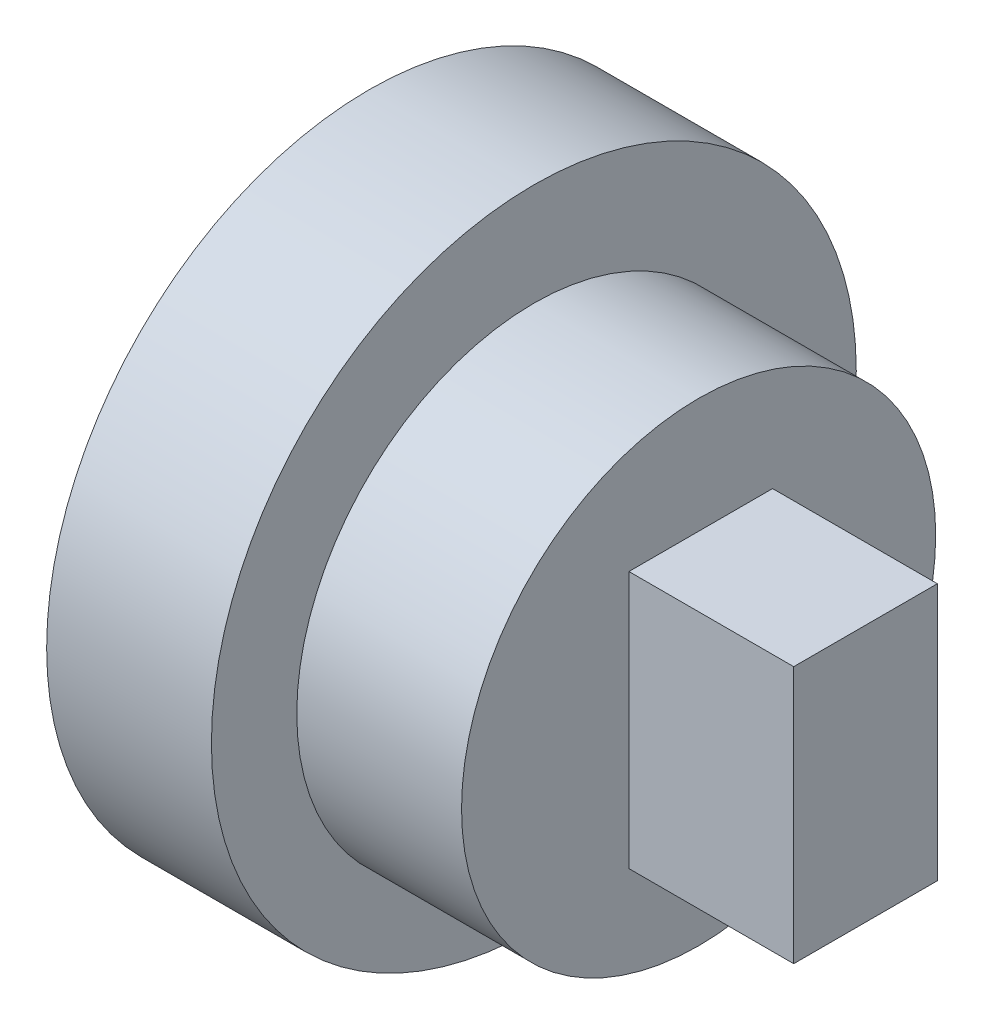
ISO-10303-21;
HEADER;
FILE_DESCRIPTION(('STEP AP214'),'2;1');
FILE_NAME('part.step','',(''),(''),'','','');
FILE_SCHEMA(('AUTOMOTIVE_DESIGN { 1 0 10303 214 1 1 1 1 }'));
ENDSEC;
DATA;
#1=APPLICATION_CONTEXT('core data for automotive mechanical design processes');
#2=APPLICATION_PROTOCOL_DEFINITION('international standard','automotive_design',2000,#1);
#3=PRODUCT_CONTEXT('',#1,'mechanical');
#4=PRODUCT('Part','Part','',(#3));
#5=PRODUCT_RELATED_PRODUCT_CATEGORY('part','',(#4));
#6=PRODUCT_DEFINITION_FORMATION('','',#4);
#7=PRODUCT_DEFINITION_CONTEXT('part definition',#1,'design');
#8=PRODUCT_DEFINITION('design','',#6,#7);
#9=PRODUCT_DEFINITION_SHAPE('','',#8);
#10=(LENGTH_UNIT() NAMED_UNIT(*) SI_UNIT(.MILLI.,.METRE.));
#11=(NAMED_UNIT(*) PLANE_ANGLE_UNIT() SI_UNIT($,.RADIAN.));
#12=(NAMED_UNIT(*) SI_UNIT($,.STERADIAN.) SOLID_ANGLE_UNIT());
#13=UNCERTAINTY_MEASURE_WITH_UNIT(LENGTH_MEASURE(1.E-05),#10,'distance_accuracy_value','');
#14=(GEOMETRIC_REPRESENTATION_CONTEXT(3) GLOBAL_UNCERTAINTY_ASSIGNED_CONTEXT((#13)) GLOBAL_UNIT_ASSIGNED_CONTEXT((#10,
#11,#12)) REPRESENTATION_CONTEXT('',''));
#15=CARTESIAN_POINT('',(0.,0.,0.));
#16=DIRECTION('',(0.,0.,1.));
#17=DIRECTION('',(1.,0.,0.));
#18=AXIS2_PLACEMENT_3D('',#15,#16,#17);
#19=CARTESIAN_POINT('',(10.,1.04198553918877,0.));
#20=DIRECTION('',(-1.,0.,0.));
#21=DIRECTION('',(0.,0.,1.));
#22=AXIS2_PLACEMENT_3D('',#19,#20,#21);
#23=CYLINDRICAL_SURFACE('',#22,19.5674415976927);
#24=CARTESIAN_POINT('',(10.,1.04198553918877,0.));
#25=DIRECTION('',(1.,0.,0.));
#26=DIRECTION('',(0.,0.,-1.));
#27=AXIS2_PLACEMENT_3D('',#24,#25,#26);
#28=CIRCLE('',#27,19.5674415976927);
#29=CARTESIAN_POINT('',(10.,1.04198553918877,-19.5674415976927));
#30=VERTEX_POINT('',#29);
#31=EDGE_CURVE('E40',#30,#30,#28,.T.);
#32=ORIENTED_EDGE('',*,*,#31,.F.);
#33=EDGE_LOOP('',(#32));
#34=FACE_BOUND('',#33,.T.);
#35=CARTESIAN_POINT('',(0.,1.04198553918877,0.));
#36=DIRECTION('',(1.,0.,0.));
#37=DIRECTION('',(0.,0.,-1.));
#38=AXIS2_PLACEMENT_3D('',#35,#36,#37);
#39=CIRCLE('',#38,19.5674415976927);
#40=CARTESIAN_POINT('',(0.,1.04198553918877,-19.5674415976927));
#41=VERTEX_POINT('',#40);
#42=EDGE_CURVE('E35',#41,#41,#39,.T.);
#43=ORIENTED_EDGE('',*,*,#42,.T.);
#44=EDGE_LOOP('',(#43));
#45=FACE_BOUND('',#44,.T.);
#46=ADVANCED_FACE('F32',(#34,#45),#23,.T.);
#47=CARTESIAN_POINT('',(10.,1.04198553918877,0.));
#48=DIRECTION('',(1.,0.,0.));
#49=DIRECTION('',(0.,0.,-1.));
#50=AXIS2_PLACEMENT_3D('',#47,#48,#49);
#51=PLANE('',#50);
#52=CARTESIAN_POINT('',(10.,0.,0.));
#53=DIRECTION('',(1.,0.,0.));
#54=DIRECTION('',(0.,0.,-1.));
#55=AXIS2_PLACEMENT_3D('',#52,#53,#54);
#56=CIRCLE('',#55,14.388112676049);
#57=CARTESIAN_POINT('',(10.,0.,-14.388112676049));
#58=VERTEX_POINT('',#57);
#59=EDGE_CURVE('E11',#58,#58,#56,.T.);
#60=ORIENTED_EDGE('',*,*,#59,.F.);
#61=EDGE_LOOP('',(#60));
#62=FACE_BOUND('',#61,.T.);
#63=ORIENTED_EDGE('',*,*,#31,.T.);
#64=EDGE_LOOP('',(#63));
#65=FACE_BOUND('',#64,.T.);
#66=ADVANCED_FACE('F111',(#62,#65),#51,.T.);
#67=CARTESIAN_POINT('',(0.,1.04198553918877,0.));
#68=DIRECTION('',(1.,0.,0.));
#69=DIRECTION('',(0.,0.,-1.));
#70=AXIS2_PLACEMENT_3D('',#67,#68,#69);
#71=PLANE('',#70);
#72=ORIENTED_EDGE('',*,*,#42,.F.);
#73=EDGE_LOOP('',(#72));
#74=FACE_BOUND('',#73,.T.);
#75=ADVANCED_FACE('F108',(#74),#71,.F.);
#76=CARTESIAN_POINT('',(20.,0.,0.));
#77=DIRECTION('',(-1.,0.,0.));
#78=DIRECTION('',(0.,0.,1.));
#79=AXIS2_PLACEMENT_3D('',#76,#77,#78);
#80=CYLINDRICAL_SURFACE('',#79,14.388112676049);
#81=CARTESIAN_POINT('',(20.,0.,0.));
#82=DIRECTION('',(1.,0.,0.));
#83=DIRECTION('',(0.,0.,-1.));
#84=AXIS2_PLACEMENT_3D('',#81,#82,#83);
#85=CIRCLE('',#84,14.388112676049);
#86=CARTESIAN_POINT('',(20.,0.,-14.388112676049));
#87=VERTEX_POINT('',#86);
#88=EDGE_CURVE('E94',#87,#87,#85,.T.);
#89=ORIENTED_EDGE('',*,*,#88,.F.);
#90=EDGE_LOOP('',(#89));
#91=FACE_BOUND('',#90,.T.);
#92=ORIENTED_EDGE('',*,*,#59,.T.);
#93=EDGE_LOOP('',(#92));
#94=FACE_BOUND('',#93,.T.);
#95=ADVANCED_FACE('F110',(#91,#94),#80,.T.);
#96=CARTESIAN_POINT('',(20.,0.,0.));
#97=DIRECTION('',(1.,0.,0.));
#98=DIRECTION('',(0.,0.,-1.));
#99=AXIS2_PLACEMENT_3D('',#96,#97,#98);
#100=PLANE('',#99);
#101=DIRECTION('',(0.,-1.,0.));
#102=VECTOR('',#101,1.);
#103=CARTESIAN_POINT('',(20.,7.4005232793013,4.22923883462545));
#104=LINE('',#103,#102);
#105=CARTESIAN_POINT('',(20.,7.4005232793013,4.22923883462545));
#106=VERTEX_POINT('',#105);
#107=CARTESIAN_POINT('',(20.,-8.2130330906196,4.22923883462545));
#108=VERTEX_POINT('',#107);
#109=EDGE_CURVE('E48',#106,#108,#104,.T.);
#110=ORIENTED_EDGE('',*,*,#109,.F.);
#111=DIRECTION('',(0.,0.,1.));
#112=VECTOR('',#111,1.);
#113=CARTESIAN_POINT('',(20.,7.4005232793013,4.22923883462545));
#114=LINE('',#113,#112);
#115=CARTESIAN_POINT('',(20.,7.4005232793013,-4.48823420707356));
#116=VERTEX_POINT('',#115);
#117=EDGE_CURVE('E52',#116,#106,#114,.T.);
#118=ORIENTED_EDGE('',*,*,#117,.F.);
#119=DIRECTION('',(0.,1.,0.));
#120=VECTOR('',#119,1.);
#121=CARTESIAN_POINT('',(20.,7.4005232793013,-4.48823420707356));
#122=LINE('',#121,#120);
#123=CARTESIAN_POINT('',(20.,-8.2130330906196,-4.48823420707356));
#124=VERTEX_POINT('',#123);
#125=EDGE_CURVE('E196',#124,#116,#122,.T.);
#126=ORIENTED_EDGE('',*,*,#125,.F.);
#127=DIRECTION('',(0.,0.,-1.));
#128=VECTOR('',#127,1.);
#129=CARTESIAN_POINT('',(20.,-8.2130330906196,4.22923883462545));
#130=LINE('',#129,#128);
#131=EDGE_CURVE('E202',#108,#124,#130,.T.);
#132=ORIENTED_EDGE('',*,*,#131,.F.);
#133=EDGE_LOOP('',(#110,#118,#126,#132));
#134=FACE_BOUND('',#133,.T.);
#135=ORIENTED_EDGE('',*,*,#88,.T.);
#136=EDGE_LOOP('',(#135));
#137=FACE_BOUND('',#136,.T.);
#138=ADVANCED_FACE('F116',(#134,#137),#100,.T.);
#139=CARTESIAN_POINT('',(30.,7.4005232793013,4.22923883462545));
#140=DIRECTION('',(0.,0.,-1.));
#141=DIRECTION('',(-1.,0.,0.));
#142=AXIS2_PLACEMENT_3D('',#139,#140,#141);
#143=PLANE('',#142);
#144=ORIENTED_EDGE('',*,*,#109,.T.);
#145=DIRECTION('',(-1.,0.,0.));
#146=VECTOR('',#145,1.);
#147=CARTESIAN_POINT('',(30.,-8.2130330906196,4.22923883462545));
#148=LINE('',#147,#146);
#149=CARTESIAN_POINT('',(30.,-8.2130330906196,4.22923883462545));
#150=VERTEX_POINT('',#149);
#151=EDGE_CURVE('E77',#150,#108,#148,.T.);
#152=ORIENTED_EDGE('',*,*,#151,.F.);
#153=DIRECTION('',(0.,-1.,0.));
#154=VECTOR('',#153,1.);
#155=CARTESIAN_POINT('',(30.,7.4005232793013,4.22923883462545));
#156=LINE('',#155,#154);
#157=CARTESIAN_POINT('',(30.,7.4005232793013,4.22923883462545));
#158=VERTEX_POINT('',#157);
#159=EDGE_CURVE('E83',#158,#150,#156,.T.);
#160=ORIENTED_EDGE('',*,*,#159,.F.);
#161=DIRECTION('',(-1.,0.,0.));
#162=VECTOR('',#161,1.);
#163=CARTESIAN_POINT('',(30.,7.4005232793013,4.22923883462545));
#164=LINE('',#163,#162);
#165=EDGE_CURVE('E194',#158,#106,#164,.T.);
#166=ORIENTED_EDGE('',*,*,#165,.T.);
#167=EDGE_LOOP('',(#144,#152,#160,#166));
#168=FACE_BOUND('',#167,.T.);
#169=ADVANCED_FACE('F93',(#168),#143,.F.);
#170=CARTESIAN_POINT('',(30.,-8.2130330906196,4.22923883462545));
#171=DIRECTION('',(0.,1.,0.));
#172=DIRECTION('',(0.,0.,1.));
#173=AXIS2_PLACEMENT_3D('',#170,#171,#172);
#174=PLANE('',#173);
#175=ORIENTED_EDGE('',*,*,#131,.T.);
#176=DIRECTION('',(-1.,0.,0.));
#177=VECTOR('',#176,1.);
#178=CARTESIAN_POINT('',(30.,-8.2130330906196,-4.48823420707356));
#179=LINE('',#178,#177);
#180=CARTESIAN_POINT('',(30.,-8.2130330906196,-4.48823420707356));
#181=VERTEX_POINT('',#180);
#182=EDGE_CURVE('E79',#181,#124,#179,.T.);
#183=ORIENTED_EDGE('',*,*,#182,.F.);
#184=DIRECTION('',(0.,0.,-1.));
#185=VECTOR('',#184,1.);
#186=CARTESIAN_POINT('',(30.,-8.2130330906196,4.22923883462545));
#187=LINE('',#186,#185);
#188=EDGE_CURVE('E72',#150,#181,#187,.T.);
#189=ORIENTED_EDGE('',*,*,#188,.F.);
#190=ORIENTED_EDGE('',*,*,#151,.T.);
#191=EDGE_LOOP('',(#175,#183,#189,#190));
#192=FACE_BOUND('',#191,.T.);
#193=ADVANCED_FACE('F75',(#192),#174,.F.);
#194=CARTESIAN_POINT('',(30.,7.4005232793013,-4.48823420707356));
#195=DIRECTION('',(0.,0.,1.));
#196=DIRECTION('',(1.,0.,0.));
#197=AXIS2_PLACEMENT_3D('',#194,#195,#196);
#198=PLANE('',#197);
#199=ORIENTED_EDGE('',*,*,#125,.T.);
#200=DIRECTION('',(-1.,0.,0.));
#201=VECTOR('',#200,1.);
#202=CARTESIAN_POINT('',(30.,7.4005232793013,-4.48823420707356));
#203=LINE('',#202,#201);
#204=CARTESIAN_POINT('',(30.,7.4005232793013,-4.48823420707356));
#205=VERTEX_POINT('',#204);
#206=EDGE_CURVE('E98',#205,#116,#203,.T.);
#207=ORIENTED_EDGE('',*,*,#206,.F.);
#208=DIRECTION('',(0.,1.,0.));
#209=VECTOR('',#208,1.);
#210=CARTESIAN_POINT('',(30.,7.4005232793013,-4.48823420707356));
#211=LINE('',#210,#209);
#212=EDGE_CURVE('E82',#181,#205,#211,.T.);
#213=ORIENTED_EDGE('',*,*,#212,.F.);
#214=ORIENTED_EDGE('',*,*,#182,.T.);
#215=EDGE_LOOP('',(#199,#207,#213,#214));
#216=FACE_BOUND('',#215,.T.);
#217=ADVANCED_FACE('F162',(#216),#198,.F.);
#218=CARTESIAN_POINT('',(30.,7.4005232793013,4.22923883462545));
#219=DIRECTION('',(0.,-1.,0.));
#220=DIRECTION('',(0.,0.,-1.));
#221=AXIS2_PLACEMENT_3D('',#218,#219,#220);
#222=PLANE('',#221);
#223=ORIENTED_EDGE('',*,*,#117,.T.);
#224=ORIENTED_EDGE('',*,*,#165,.F.);
#225=DIRECTION('',(0.,0.,1.));
#226=VECTOR('',#225,1.);
#227=CARTESIAN_POINT('',(30.,7.4005232793013,4.22923883462545));
#228=LINE('',#227,#226);
#229=EDGE_CURVE('E88',#205,#158,#228,.T.);
#230=ORIENTED_EDGE('',*,*,#229,.F.);
#231=ORIENTED_EDGE('',*,*,#206,.T.);
#232=EDGE_LOOP('',(#223,#224,#230,#231));
#233=FACE_BOUND('',#232,.T.);
#234=ADVANCED_FACE('F171',(#233),#222,.F.);
#235=CARTESIAN_POINT('',(30.,0.,0.));
#236=DIRECTION('',(1.,0.,0.));
#237=DIRECTION('',(0.,0.,-1.));
#238=AXIS2_PLACEMENT_3D('',#235,#236,#237);
#239=PLANE('',#238);
#240=ORIENTED_EDGE('',*,*,#159,.T.);
#241=ORIENTED_EDGE('',*,*,#188,.T.);
#242=ORIENTED_EDGE('',*,*,#212,.T.);
#243=ORIENTED_EDGE('',*,*,#229,.T.);
#244=EDGE_LOOP('',(#240,#241,#242,#243));
#245=FACE_BOUND('',#244,.T.);
#246=ADVANCED_FACE('F86',(#245),#239,.T.);
#247=CLOSED_SHELL('',(#46,#66,#75,#95,#138,#169,#193,#217,#234,#246));
#248=MANIFOLD_SOLID_BREP('B2',#247);
#249=ADVANCED_BREP_SHAPE_REPRESENTATION('',(#18,#248),#14);
#250=SHAPE_DEFINITION_REPRESENTATION(#9,#249);
ENDSEC;
END-ISO-10303-21;
